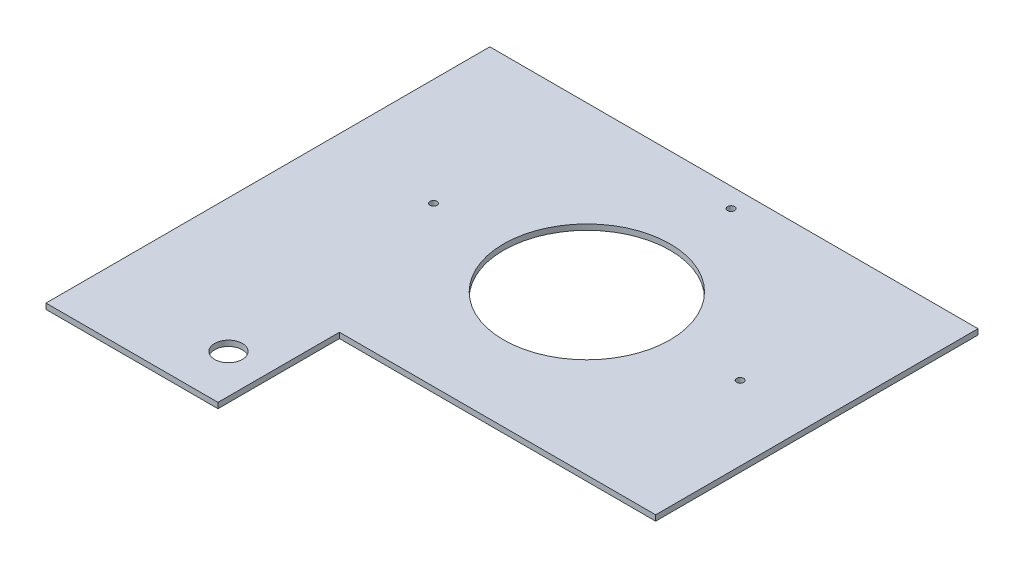
ISO-10303-21;
HEADER;
FILE_DESCRIPTION(('STEP AP214'),'2;1');
FILE_NAME('part.step','',(''),(''),'','','');
FILE_SCHEMA(('AUTOMOTIVE_DESIGN { 1 0 10303 214 1 1 1 1 }'));
ENDSEC;
DATA;
#1=APPLICATION_CONTEXT('core data for automotive mechanical design processes');
#2=APPLICATION_PROTOCOL_DEFINITION('international standard','automotive_design',2000,#1);
#3=PRODUCT_CONTEXT('',#1,'mechanical');
#4=PRODUCT('Part','Part','',(#3));
#5=PRODUCT_RELATED_PRODUCT_CATEGORY('part','',(#4));
#6=PRODUCT_DEFINITION_FORMATION('','',#4);
#7=PRODUCT_DEFINITION_CONTEXT('part definition',#1,'design');
#8=PRODUCT_DEFINITION('design','',#6,#7);
#9=PRODUCT_DEFINITION_SHAPE('','',#8);
#10=(LENGTH_UNIT() NAMED_UNIT(*) SI_UNIT(.MILLI.,.METRE.));
#11=(NAMED_UNIT(*) PLANE_ANGLE_UNIT() SI_UNIT($,.RADIAN.));
#12=(NAMED_UNIT(*) SI_UNIT($,.STERADIAN.) SOLID_ANGLE_UNIT());
#13=UNCERTAINTY_MEASURE_WITH_UNIT(LENGTH_MEASURE(1.E-05),#10,'distance_accuracy_value','');
#14=(GEOMETRIC_REPRESENTATION_CONTEXT(3) GLOBAL_UNCERTAINTY_ASSIGNED_CONTEXT((#13)) GLOBAL_UNIT_ASSIGNED_CONTEXT((#10,
#11,#12)) REPRESENTATION_CONTEXT('',''));
#15=CARTESIAN_POINT('',(0.,0.,0.));
#16=DIRECTION('',(0.,0.,1.));
#17=DIRECTION('',(1.,0.,0.));
#18=AXIS2_PLACEMENT_3D('',#15,#16,#17);
#19=CARTESIAN_POINT('',(0.,5.,0.));
#20=DIRECTION('',(0.,-1.,0.));
#21=DIRECTION('',(0.,0.,-1.));
#22=AXIS2_PLACEMENT_3D('',#19,#20,#21);
#23=PLANE('',#22);
#24=DIRECTION('',(1.,0.,0.));
#25=VECTOR('',#24,1.);
#26=CARTESIAN_POINT('',(-79.0240692738557,5.,222.426710105648));
#27=LINE('',#26,#25);
#28=CARTESIAN_POINT('',(-164.024069273856,5.,222.426710105648));
#29=VERTEX_POINT('',#28);
#30=CARTESIAN_POINT('',(-9.02406927385568,5.,222.426710105648));
#31=VERTEX_POINT('',#30);
#32=EDGE_CURVE('E133',#29,#31,#27,.T.);
#33=ORIENTED_EDGE('',*,*,#32,.T.);
#34=DIRECTION('',(0.,0.,-1.));
#35=VECTOR('',#34,1.);
#36=CARTESIAN_POINT('',(-9.0240692738557,5.,112.958468136333));
#37=LINE('',#36,#35);
#38=CARTESIAN_POINT('',(-9.0240692738557,5.,112.958468136333));
#39=VERTEX_POINT('',#38);
#40=EDGE_CURVE('E88',#31,#39,#37,.T.);
#41=ORIENTED_EDGE('',*,*,#40,.T.);
#42=DIRECTION('',(1.,0.,0.));
#43=VECTOR('',#42,1.);
#44=CARTESIAN_POINT('',(-9.0240692738557,5.,112.958468136333));
#45=LINE('',#44,#43);
#46=CARTESIAN_POINT('',(275.975930726144,5.,112.958468136333));
#47=VERTEX_POINT('',#46);
#48=EDGE_CURVE('E102',#39,#47,#45,.T.);
#49=ORIENTED_EDGE('',*,*,#48,.T.);
#50=DIRECTION('',(0.,0.,-1.));
#51=VECTOR('',#50,1.);
#52=CARTESIAN_POINT('',(275.975930726144,5.,-177.56894216173));
#53=LINE('',#52,#51);
#54=CARTESIAN_POINT('',(275.975930726144,5.,-177.56894216173));
#55=VERTEX_POINT('',#54);
#56=EDGE_CURVE('E95',#47,#55,#53,.T.);
#57=ORIENTED_EDGE('',*,*,#56,.T.);
#58=DIRECTION('',(-1.,0.,0.));
#59=VECTOR('',#58,1.);
#60=CARTESIAN_POINT('',(275.975930726144,5.,-177.56894216173));
#61=LINE('',#60,#59);
#62=CARTESIAN_POINT('',(-164.024069273856,5.,-177.56894216173));
#63=VERTEX_POINT('',#62);
#64=EDGE_CURVE('E99',#55,#63,#61,.T.);
#65=ORIENTED_EDGE('',*,*,#64,.T.);
#66=DIRECTION('',(0.,0.,1.));
#67=VECTOR('',#66,1.);
#68=CARTESIAN_POINT('',(-164.024069273856,5.,-177.56894216173));
#69=LINE('',#68,#67);
#70=EDGE_CURVE('E52',#63,#29,#69,.T.);
#71=ORIENTED_EDGE('',*,*,#70,.T.);
#72=EDGE_LOOP('',(#33,#41,#49,#57,#65,#71));
#73=FACE_BOUND('',#72,.T.);
#74=CARTESIAN_POINT('',(70.9759307261443,5.,-30.0257980897461));
#75=DIRECTION('',(0.,1.,0.));
#76=DIRECTION('',(0.,0.,1.));
#77=AXIS2_PLACEMENT_3D('',#74,#75,#76);
#78=CIRCLE('',#77,75.);
#79=CARTESIAN_POINT('',(70.9759307261443,5.,44.974201910254));
#80=VERTEX_POINT('',#79);
#81=EDGE_CURVE('E125',#80,#80,#78,.T.);
#82=ORIENTED_EDGE('',*,*,#81,.F.);
#83=EDGE_LOOP('',(#82));
#84=FACE_BOUND('',#83,.T.);
#85=CARTESIAN_POINT('',(70.9759307261443,5.,-160.025798089746));
#86=DIRECTION('',(0.,1.,0.));
#87=DIRECTION('',(0.,0.,1.));
#88=AXIS2_PLACEMENT_3D('',#85,#86,#87);
#89=CIRCLE('',#88,3.175);
#90=CARTESIAN_POINT('',(70.9759307261443,5.,-156.850798089746));
#91=VERTEX_POINT('',#90);
#92=EDGE_CURVE('E153',#91,#91,#89,.T.);
#93=ORIENTED_EDGE('',*,*,#92,.F.);
#94=EDGE_LOOP('',(#93));
#95=FACE_BOUND('',#94,.T.);
#96=CARTESIAN_POINT('',(-44.0240692738557,5.,177.958468136333));
#97=DIRECTION('',(0.,1.,0.));
#98=DIRECTION('',(0.,0.,1.));
#99=AXIS2_PLACEMENT_3D('',#96,#97,#98);
#100=CIRCLE('',#99,12.5);
#101=CARTESIAN_POINT('',(-44.0240692738557,5.,190.458468136333));
#102=VERTEX_POINT('',#101);
#103=EDGE_CURVE('E159',#102,#102,#100,.T.);
#104=ORIENTED_EDGE('',*,*,#103,.F.);
#105=EDGE_LOOP('',(#104));
#106=FACE_BOUND('',#105,.T.);
#107=CARTESIAN_POINT('',(209.175930726144,5.,-30.0257980897461));
#108=DIRECTION('',(0.,1.,0.));
#109=DIRECTION('',(0.,0.,1.));
#110=AXIS2_PLACEMENT_3D('',#107,#108,#109);
#111=CIRCLE('',#110,3.175);
#112=CARTESIAN_POINT('',(209.175930726144,5.,-26.8507980897461));
#113=VERTEX_POINT('',#112);
#114=EDGE_CURVE('E165',#113,#113,#111,.T.);
#115=ORIENTED_EDGE('',*,*,#114,.F.);
#116=EDGE_LOOP('',(#115));
#117=FACE_BOUND('',#116,.T.);
#118=CARTESIAN_POINT('',(-67.2240692738557,5.,-30.0257980897461));
#119=DIRECTION('',(0.,1.,0.));
#120=DIRECTION('',(0.,0.,1.));
#121=AXIS2_PLACEMENT_3D('',#118,#119,#120);
#122=CIRCLE('',#121,3.175);
#123=CARTESIAN_POINT('',(-67.2240692738557,5.,-26.8507980897461));
#124=VERTEX_POINT('',#123);
#125=EDGE_CURVE('E171',#124,#124,#122,.T.);
#126=ORIENTED_EDGE('',*,*,#125,.F.);
#127=EDGE_LOOP('',(#126));
#128=FACE_BOUND('',#127,.T.);
#129=ADVANCED_FACE('F35',(#73,#84,#95,#106,#117,#128),#23,.F.);
#130=CARTESIAN_POINT('',(0.,0.,0.));
#131=DIRECTION('',(0.,-1.,0.));
#132=DIRECTION('',(0.,0.,-1.));
#133=AXIS2_PLACEMENT_3D('',#130,#131,#132);
#134=PLANE('',#133);
#135=CARTESIAN_POINT('',(209.175930726144,0.,-30.0257980897461));
#136=DIRECTION('',(0.,1.,0.));
#137=DIRECTION('',(0.,0.,1.));
#138=AXIS2_PLACEMENT_3D('',#135,#136,#137);
#139=CIRCLE('',#138,3.175);
#140=CARTESIAN_POINT('',(209.175930726144,0.,-26.8507980897461));
#141=VERTEX_POINT('',#140);
#142=EDGE_CURVE('E168',#141,#141,#139,.T.);
#143=ORIENTED_EDGE('',*,*,#142,.T.);
#144=EDGE_LOOP('',(#143));
#145=FACE_BOUND('',#144,.T.);
#146=CARTESIAN_POINT('',(70.9759307261443,0.,-160.025798089746));
#147=DIRECTION('',(0.,1.,0.));
#148=DIRECTION('',(0.,0.,1.));
#149=AXIS2_PLACEMENT_3D('',#146,#147,#148);
#150=CIRCLE('',#149,3.175);
#151=CARTESIAN_POINT('',(70.9759307261443,0.,-156.850798089746));
#152=VERTEX_POINT('',#151);
#153=EDGE_CURVE('E156',#152,#152,#150,.T.);
#154=ORIENTED_EDGE('',*,*,#153,.T.);
#155=EDGE_LOOP('',(#154));
#156=FACE_BOUND('',#155,.T.);
#157=DIRECTION('',(0.,0.,-1.));
#158=VECTOR('',#157,1.);
#159=CARTESIAN_POINT('',(-9.0240692738557,0.,112.958468136333));
#160=LINE('',#159,#158);
#161=CARTESIAN_POINT('',(-9.02406927385568,0.,222.426710105648));
#162=VERTEX_POINT('',#161);
#163=CARTESIAN_POINT('',(-9.0240692738557,0.,112.958468136333));
#164=VERTEX_POINT('',#163);
#165=EDGE_CURVE('E122',#162,#164,#160,.T.);
#166=ORIENTED_EDGE('',*,*,#165,.F.);
#167=DIRECTION('',(1.,0.,0.));
#168=VECTOR('',#167,1.);
#169=CARTESIAN_POINT('',(-164.024069273856,0.,222.426710105648));
#170=LINE('',#169,#168);
#171=CARTESIAN_POINT('',(-164.024069273856,0.,222.426710105648));
#172=VERTEX_POINT('',#171);
#173=EDGE_CURVE('E131',#172,#162,#170,.T.);
#174=ORIENTED_EDGE('',*,*,#173,.F.);
#175=DIRECTION('',(0.,0.,1.));
#176=VECTOR('',#175,1.);
#177=CARTESIAN_POINT('',(-164.024069273856,0.,189.256710105648));
#178=LINE('',#177,#176);
#179=CARTESIAN_POINT('',(-164.024069273856,0.,-177.56894216173));
#180=VERTEX_POINT('',#179);
#181=EDGE_CURVE('E75',#180,#172,#178,.T.);
#182=ORIENTED_EDGE('',*,*,#181,.F.);
#183=DIRECTION('',(-1.,0.,0.));
#184=VECTOR('',#183,1.);
#185=CARTESIAN_POINT('',(275.975930726144,0.,-177.56894216173));
#186=LINE('',#185,#184);
#187=CARTESIAN_POINT('',(275.975930726144,0.,-177.56894216173));
#188=VERTEX_POINT('',#187);
#189=EDGE_CURVE('E128',#188,#180,#186,.T.);
#190=ORIENTED_EDGE('',*,*,#189,.F.);
#191=DIRECTION('',(0.,0.,-1.));
#192=VECTOR('',#191,1.);
#193=CARTESIAN_POINT('',(275.975930726144,0.,-177.56894216173));
#194=LINE('',#193,#192);
#195=CARTESIAN_POINT('',(275.975930726144,0.,112.958468136333));
#196=VERTEX_POINT('',#195);
#197=EDGE_CURVE('E111',#196,#188,#194,.T.);
#198=ORIENTED_EDGE('',*,*,#197,.F.);
#199=DIRECTION('',(1.,0.,0.));
#200=VECTOR('',#199,1.);
#201=CARTESIAN_POINT('',(-9.0240692738557,0.,112.958468136333));
#202=LINE('',#201,#200);
#203=EDGE_CURVE('E124',#164,#196,#202,.T.);
#204=ORIENTED_EDGE('',*,*,#203,.F.);
#205=EDGE_LOOP('',(#166,#174,#182,#190,#198,#204));
#206=FACE_BOUND('',#205,.T.);
#207=CARTESIAN_POINT('',(70.9759307261443,0.,-30.0257980897461));
#208=DIRECTION('',(0.,1.,0.));
#209=DIRECTION('',(0.,0.,1.));
#210=AXIS2_PLACEMENT_3D('',#207,#208,#209);
#211=CIRCLE('',#210,75.);
#212=CARTESIAN_POINT('',(70.9759307261443,0.,44.974201910254));
#213=VERTEX_POINT('',#212);
#214=EDGE_CURVE('E150',#213,#213,#211,.T.);
#215=ORIENTED_EDGE('',*,*,#214,.T.);
#216=EDGE_LOOP('',(#215));
#217=FACE_BOUND('',#216,.T.);
#218=CARTESIAN_POINT('',(-44.0240692738557,0.,177.958468136333));
#219=DIRECTION('',(0.,1.,0.));
#220=DIRECTION('',(0.,0.,1.));
#221=AXIS2_PLACEMENT_3D('',#218,#219,#220);
#222=CIRCLE('',#221,12.5);
#223=CARTESIAN_POINT('',(-44.0240692738557,0.,190.458468136333));
#224=VERTEX_POINT('',#223);
#225=EDGE_CURVE('E162',#224,#224,#222,.T.);
#226=ORIENTED_EDGE('',*,*,#225,.T.);
#227=EDGE_LOOP('',(#226));
#228=FACE_BOUND('',#227,.T.);
#229=CARTESIAN_POINT('',(-67.2240692738557,0.,-30.0257980897461));
#230=DIRECTION('',(0.,1.,0.));
#231=DIRECTION('',(0.,0.,1.));
#232=AXIS2_PLACEMENT_3D('',#229,#230,#231);
#233=CIRCLE('',#232,3.175);
#234=CARTESIAN_POINT('',(-67.2240692738557,0.,-26.8507980897461));
#235=VERTEX_POINT('',#234);
#236=EDGE_CURVE('E174',#235,#235,#233,.T.);
#237=ORIENTED_EDGE('',*,*,#236,.T.);
#238=EDGE_LOOP('',(#237));
#239=FACE_BOUND('',#238,.T.);
#240=ADVANCED_FACE('F141',(#145,#156,#206,#217,#228,#239),#134,.T.);
#241=CARTESIAN_POINT('',(-9.0240692738557,5.,112.958468136333));
#242=DIRECTION('',(-1.,0.,0.));
#243=DIRECTION('',(0.,0.,1.));
#244=AXIS2_PLACEMENT_3D('',#241,#242,#243);
#245=PLANE('',#244);
#246=ORIENTED_EDGE('',*,*,#165,.T.);
#247=DIRECTION('',(0.,-1.,0.));
#248=VECTOR('',#247,1.);
#249=CARTESIAN_POINT('',(-9.0240692738557,5.,112.958468136333));
#250=LINE('',#249,#248);
#251=EDGE_CURVE('E44',#39,#164,#250,.T.);
#252=ORIENTED_EDGE('',*,*,#251,.F.);
#253=ORIENTED_EDGE('',*,*,#40,.F.);
#254=DIRECTION('',(0.,-1.,0.));
#255=VECTOR('',#254,1.);
#256=CARTESIAN_POINT('',(-9.02406927385568,5.,222.426710105648));
#257=LINE('',#256,#255);
#258=EDGE_CURVE('E11',#31,#162,#257,.T.);
#259=ORIENTED_EDGE('',*,*,#258,.T.);
#260=EDGE_LOOP('',(#246,#252,#253,#259));
#261=FACE_BOUND('',#260,.T.);
#262=ADVANCED_FACE('F37',(#261),#245,.F.);
#263=CARTESIAN_POINT('',(-9.0240692738557,5.,112.958468136333));
#264=DIRECTION('',(0.,0.,-1.));
#265=DIRECTION('',(-1.,0.,0.));
#266=AXIS2_PLACEMENT_3D('',#263,#264,#265);
#267=PLANE('',#266);
#268=ORIENTED_EDGE('',*,*,#203,.T.);
#269=DIRECTION('',(0.,-1.,0.));
#270=VECTOR('',#269,1.);
#271=CARTESIAN_POINT('',(275.975930726144,5.,112.958468136333));
#272=LINE('',#271,#270);
#273=EDGE_CURVE('E113',#47,#196,#272,.T.);
#274=ORIENTED_EDGE('',*,*,#273,.F.);
#275=ORIENTED_EDGE('',*,*,#48,.F.);
#276=ORIENTED_EDGE('',*,*,#251,.T.);
#277=EDGE_LOOP('',(#268,#274,#275,#276));
#278=FACE_BOUND('',#277,.T.);
#279=ADVANCED_FACE('F139',(#278),#267,.F.);
#280=CARTESIAN_POINT('',(275.975930726144,5.,-177.56894216173));
#281=DIRECTION('',(-1.,0.,0.));
#282=DIRECTION('',(0.,0.,1.));
#283=AXIS2_PLACEMENT_3D('',#280,#281,#282);
#284=PLANE('',#283);
#285=ORIENTED_EDGE('',*,*,#197,.T.);
#286=DIRECTION('',(0.,-1.,0.));
#287=VECTOR('',#286,1.);
#288=CARTESIAN_POINT('',(275.975930726144,5.,-177.56894216173));
#289=LINE('',#288,#287);
#290=EDGE_CURVE('E108',#55,#188,#289,.T.);
#291=ORIENTED_EDGE('',*,*,#290,.F.);
#292=ORIENTED_EDGE('',*,*,#56,.F.);
#293=ORIENTED_EDGE('',*,*,#273,.T.);
#294=EDGE_LOOP('',(#285,#291,#292,#293));
#295=FACE_BOUND('',#294,.T.);
#296=ADVANCED_FACE('F109',(#295),#284,.F.);
#297=CARTESIAN_POINT('',(275.975930726144,5.,-177.56894216173));
#298=DIRECTION('',(0.,0.,1.));
#299=DIRECTION('',(1.,0.,0.));
#300=AXIS2_PLACEMENT_3D('',#297,#298,#299);
#301=PLANE('',#300);
#302=ORIENTED_EDGE('',*,*,#189,.T.);
#303=DIRECTION('',(0.,-1.,0.));
#304=VECTOR('',#303,1.);
#305=CARTESIAN_POINT('',(-164.024069273856,5.,-177.56894216173));
#306=LINE('',#305,#304);
#307=EDGE_CURVE('E114',#63,#180,#306,.T.);
#308=ORIENTED_EDGE('',*,*,#307,.F.);
#309=ORIENTED_EDGE('',*,*,#64,.F.);
#310=ORIENTED_EDGE('',*,*,#290,.T.);
#311=EDGE_LOOP('',(#302,#308,#309,#310));
#312=FACE_BOUND('',#311,.T.);
#313=ADVANCED_FACE('F116',(#312),#301,.F.);
#314=CARTESIAN_POINT('',(-164.024069273856,5.,189.256710105648));
#315=DIRECTION('',(1.,0.,0.));
#316=DIRECTION('',(0.,0.,-1.));
#317=AXIS2_PLACEMENT_3D('',#314,#315,#316);
#318=PLANE('',#317);
#319=ORIENTED_EDGE('',*,*,#181,.T.);
#320=DIRECTION('',(0.,-1.,0.));
#321=VECTOR('',#320,1.);
#322=CARTESIAN_POINT('',(-164.024069273856,5.,222.426710105648));
#323=LINE('',#322,#321);
#324=EDGE_CURVE('E118',#29,#172,#323,.T.);
#325=ORIENTED_EDGE('',*,*,#324,.F.);
#326=ORIENTED_EDGE('',*,*,#70,.F.);
#327=ORIENTED_EDGE('',*,*,#307,.T.);
#328=EDGE_LOOP('',(#319,#325,#326,#327));
#329=FACE_BOUND('',#328,.T.);
#330=ADVANCED_FACE('F143',(#329),#318,.F.);
#331=CARTESIAN_POINT('',(-164.024069273856,5.,222.426710105648));
#332=DIRECTION('',(0.,0.,-1.));
#333=DIRECTION('',(-1.,0.,0.));
#334=AXIS2_PLACEMENT_3D('',#331,#332,#333);
#335=PLANE('',#334);
#336=ORIENTED_EDGE('',*,*,#173,.T.);
#337=ORIENTED_EDGE('',*,*,#258,.F.);
#338=ORIENTED_EDGE('',*,*,#32,.F.);
#339=ORIENTED_EDGE('',*,*,#324,.T.);
#340=EDGE_LOOP('',(#336,#337,#338,#339));
#341=FACE_BOUND('',#340,.T.);
#342=ADVANCED_FACE('F145',(#341),#335,.F.);
#343=CARTESIAN_POINT('',(70.9759307261443,5.,-30.0257980897461));
#344=DIRECTION('',(0.,-1.,0.));
#345=DIRECTION('',(0.,0.,-1.));
#346=AXIS2_PLACEMENT_3D('',#343,#344,#345);
#347=CYLINDRICAL_SURFACE('',#346,75.);
#348=ORIENTED_EDGE('',*,*,#81,.T.);
#349=EDGE_LOOP('',(#348));
#350=FACE_BOUND('',#349,.T.);
#351=ORIENTED_EDGE('',*,*,#214,.F.);
#352=EDGE_LOOP('',(#351));
#353=FACE_BOUND('',#352,.T.);
#354=ADVANCED_FACE('F191',(#350,#353),#347,.F.);
#355=CARTESIAN_POINT('',(70.9759307261443,5.,-160.025798089746));
#356=DIRECTION('',(0.,-1.,0.));
#357=DIRECTION('',(0.,0.,-1.));
#358=AXIS2_PLACEMENT_3D('',#355,#356,#357);
#359=CYLINDRICAL_SURFACE('',#358,3.175);
#360=ORIENTED_EDGE('',*,*,#92,.T.);
#361=EDGE_LOOP('',(#360));
#362=FACE_BOUND('',#361,.T.);
#363=ORIENTED_EDGE('',*,*,#153,.F.);
#364=EDGE_LOOP('',(#363));
#365=FACE_BOUND('',#364,.T.);
#366=ADVANCED_FACE('F272',(#362,#365),#359,.F.);
#367=CARTESIAN_POINT('',(-44.0240692738557,5.,177.958468136333));
#368=DIRECTION('',(0.,-1.,0.));
#369=DIRECTION('',(0.,0.,-1.));
#370=AXIS2_PLACEMENT_3D('',#367,#368,#369);
#371=CYLINDRICAL_SURFACE('',#370,12.5);
#372=ORIENTED_EDGE('',*,*,#103,.T.);
#373=EDGE_LOOP('',(#372));
#374=FACE_BOUND('',#373,.T.);
#375=ORIENTED_EDGE('',*,*,#225,.F.);
#376=EDGE_LOOP('',(#375));
#377=FACE_BOUND('',#376,.T.);
#378=ADVANCED_FACE('F280',(#374,#377),#371,.F.);
#379=CARTESIAN_POINT('',(209.175930726144,5.,-30.0257980897461));
#380=DIRECTION('',(0.,-1.,0.));
#381=DIRECTION('',(0.,0.,-1.));
#382=AXIS2_PLACEMENT_3D('',#379,#380,#381);
#383=CYLINDRICAL_SURFACE('',#382,3.175);
#384=ORIENTED_EDGE('',*,*,#114,.T.);
#385=EDGE_LOOP('',(#384));
#386=FACE_BOUND('',#385,.T.);
#387=ORIENTED_EDGE('',*,*,#142,.F.);
#388=EDGE_LOOP('',(#387));
#389=FACE_BOUND('',#388,.T.);
#390=ADVANCED_FACE('F288',(#386,#389),#383,.F.);
#391=CARTESIAN_POINT('',(-67.2240692738557,5.,-30.0257980897461));
#392=DIRECTION('',(0.,-1.,0.));
#393=DIRECTION('',(0.,0.,-1.));
#394=AXIS2_PLACEMENT_3D('',#391,#392,#393);
#395=CYLINDRICAL_SURFACE('',#394,3.175);
#396=ORIENTED_EDGE('',*,*,#125,.T.);
#397=EDGE_LOOP('',(#396));
#398=FACE_BOUND('',#397,.T.);
#399=ORIENTED_EDGE('',*,*,#236,.F.);
#400=EDGE_LOOP('',(#399));
#401=FACE_BOUND('',#400,.T.);
#402=ADVANCED_FACE('F180',(#398,#401),#395,.F.);
#403=CLOSED_SHELL('',(#129,#240,#262,#279,#296,#313,#330,#342,#354,#366,#378,#390,#402));
#404=MANIFOLD_SOLID_BREP('B2',#403);
#405=ADVANCED_BREP_SHAPE_REPRESENTATION('',(#18,#404),#14);
#406=SHAPE_DEFINITION_REPRESENTATION(#9,#405);
ENDSEC;
END-ISO-10303-21;
